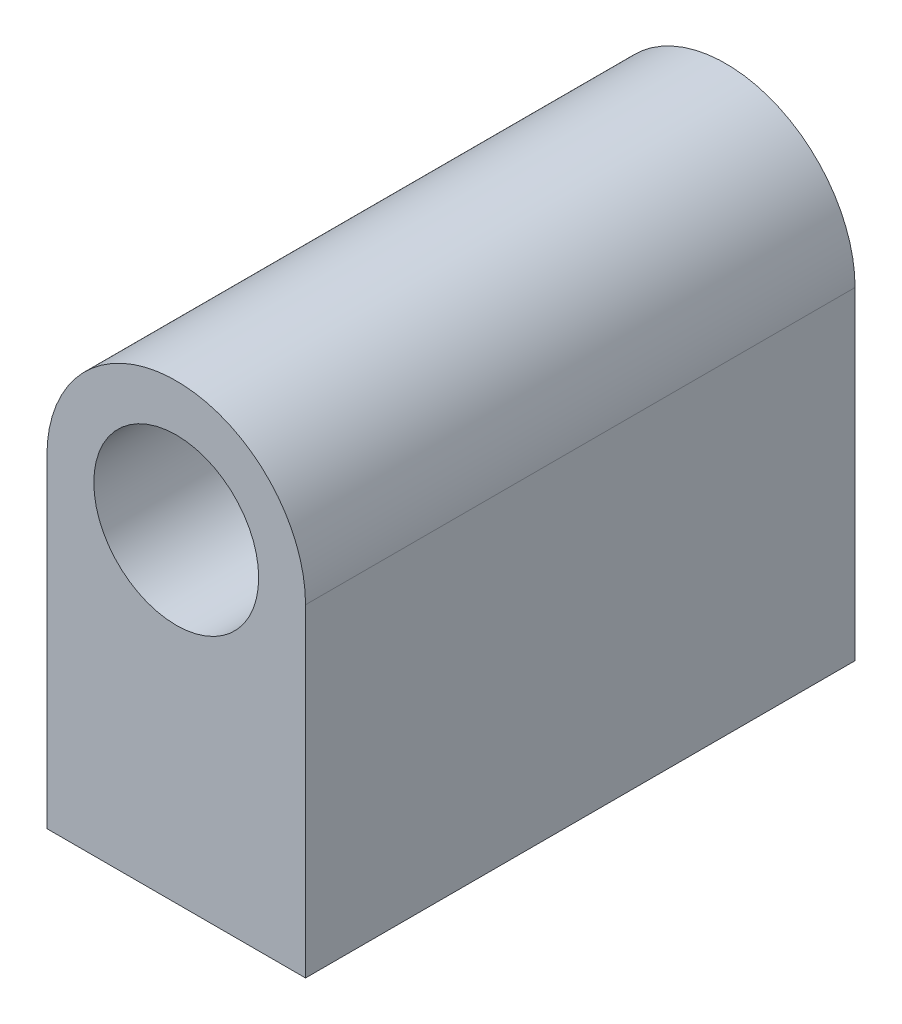
ISO-10303-21;
HEADER;
FILE_DESCRIPTION(('STEP AP214'),'2;1');
FILE_NAME('part.step','',(''),(''),'','','');
FILE_SCHEMA(('AUTOMOTIVE_DESIGN { 1 0 10303 214 1 1 1 1 }'));
ENDSEC;
DATA;
#1=APPLICATION_CONTEXT('core data for automotive mechanical design processes');
#2=APPLICATION_PROTOCOL_DEFINITION('international standard','automotive_design',2000,#1);
#3=PRODUCT_CONTEXT('',#1,'mechanical');
#4=PRODUCT('Part','Part','',(#3));
#5=PRODUCT_RELATED_PRODUCT_CATEGORY('part','',(#4));
#6=PRODUCT_DEFINITION_FORMATION('','',#4);
#7=PRODUCT_DEFINITION_CONTEXT('part definition',#1,'design');
#8=PRODUCT_DEFINITION('design','',#6,#7);
#9=PRODUCT_DEFINITION_SHAPE('','',#8);
#10=(LENGTH_UNIT() NAMED_UNIT(*) SI_UNIT(.MILLI.,.METRE.));
#11=(NAMED_UNIT(*) PLANE_ANGLE_UNIT() SI_UNIT($,.RADIAN.));
#12=(NAMED_UNIT(*) SI_UNIT($,.STERADIAN.) SOLID_ANGLE_UNIT());
#13=UNCERTAINTY_MEASURE_WITH_UNIT(LENGTH_MEASURE(1.E-05),#10,'distance_accuracy_value','');
#14=(GEOMETRIC_REPRESENTATION_CONTEXT(3) GLOBAL_UNCERTAINTY_ASSIGNED_CONTEXT((#13)) GLOBAL_UNIT_ASSIGNED_CONTEXT((#10,
#11,#12)) REPRESENTATION_CONTEXT('',''));
#15=CARTESIAN_POINT('',(0.,0.,0.));
#16=DIRECTION('',(0.,0.,1.));
#17=DIRECTION('',(1.,0.,0.));
#18=AXIS2_PLACEMENT_3D('',#15,#16,#17);
#19=CARTESIAN_POINT('',(0.,0.,6.));
#20=DIRECTION('',(0.,0.,-1.));
#21=DIRECTION('',(-1.,0.,0.));
#22=AXIS2_PLACEMENT_3D('',#19,#20,#21);
#23=CYLINDRICAL_SURFACE('',#22,4.);
#24=DIRECTION('',(0.,0.,-1.));
#25=VECTOR('',#24,1.);
#26=CARTESIAN_POINT('',(-4.,0.,33.1245154965971));
#27=LINE('',#26,#25);
#28=CARTESIAN_POINT('',(-4.,0.,17.));
#29=VERTEX_POINT('',#28);
#30=CARTESIAN_POINT('',(-4.,0.,0.));
#31=VERTEX_POINT('',#30);
#32=EDGE_CURVE('E77',#29,#31,#27,.T.);
#33=ORIENTED_EDGE('',*,*,#32,.F.);
#34=CARTESIAN_POINT('',(0.,0.,17.));
#35=DIRECTION('',(0.,0.,1.));
#36=DIRECTION('',(1.,0.,0.));
#37=AXIS2_PLACEMENT_3D('',#34,#35,#36);
#38=CIRCLE('',#37,4.);
#39=CARTESIAN_POINT('',(4.,0.,17.));
#40=VERTEX_POINT('',#39);
#41=EDGE_CURVE('E84',#40,#29,#38,.T.);
#42=ORIENTED_EDGE('',*,*,#41,.F.);
#43=DIRECTION('',(0.,0.,-1.));
#44=VECTOR('',#43,1.);
#45=CARTESIAN_POINT('',(4.,0.,33.1245154965971));
#46=LINE('',#45,#44);
#47=CARTESIAN_POINT('',(4.,0.,0.));
#48=VERTEX_POINT('',#47);
#49=EDGE_CURVE('E47',#40,#48,#46,.T.);
#50=ORIENTED_EDGE('',*,*,#49,.T.);
#51=CARTESIAN_POINT('',(0.,0.,0.));
#52=DIRECTION('',(0.,0.,1.));
#53=DIRECTION('',(1.,0.,0.));
#54=AXIS2_PLACEMENT_3D('',#51,#52,#53);
#55=CIRCLE('',#54,4.);
#56=EDGE_CURVE('E11',#48,#31,#55,.T.);
#57=ORIENTED_EDGE('',*,*,#56,.T.);
#58=EDGE_LOOP('',(#33,#42,#50,#57));
#59=FACE_BOUND('',#58,.T.);
#60=ADVANCED_FACE('F33',(#59),#23,.T.);
#61=CARTESIAN_POINT('',(0.,0.,6.));
#62=DIRECTION('',(0.,0.,1.));
#63=DIRECTION('',(1.,0.,0.));
#64=AXIS2_PLACEMENT_3D('',#61,#62,#63);
#65=PLANE('',#64);
#66=CARTESIAN_POINT('',(0.,0.,6.));
#67=DIRECTION('',(0.,0.,1.));
#68=DIRECTION('',(1.,0.,0.));
#69=AXIS2_PLACEMENT_3D('',#66,#67,#68);
#70=CIRCLE('',#69,2.3);
#71=CARTESIAN_POINT('',(2.3,0.,6.));
#72=VERTEX_POINT('',#71);
#73=EDGE_CURVE('E40',#72,#72,#70,.T.);
#74=ORIENTED_EDGE('',*,*,#73,.F.);
#75=EDGE_LOOP('',(#74));
#76=FACE_BOUND('',#75,.T.);
#77=CARTESIAN_POINT('',(0.,0.,6.));
#78=DIRECTION('',(0.,0.,1.));
#79=DIRECTION('',(1.,0.,0.));
#80=AXIS2_PLACEMENT_3D('',#77,#78,#79);
#81=CIRCLE('',#80,2.55);
#82=CARTESIAN_POINT('',(2.55,0.,6.));
#83=VERTEX_POINT('',#82);
#84=EDGE_CURVE('E95',#83,#83,#81,.T.);
#85=ORIENTED_EDGE('',*,*,#84,.T.);
#86=EDGE_LOOP('',(#85));
#87=FACE_BOUND('',#86,.T.);
#88=ADVANCED_FACE('F105',(#76,#87),#65,.T.);
#89=CARTESIAN_POINT('',(0.,0.,0.));
#90=DIRECTION('',(0.,0.,1.));
#91=DIRECTION('',(1.,0.,0.));
#92=AXIS2_PLACEMENT_3D('',#89,#90,#91);
#93=PLANE('',#92);
#94=ORIENTED_EDGE('',*,*,#56,.F.);
#95=DIRECTION('',(0.,-1.,0.));
#96=VECTOR('',#95,1.);
#97=CARTESIAN_POINT('',(4.,0.,0.));
#98=LINE('',#97,#96);
#99=CARTESIAN_POINT('',(4.,-10.,0.));
#100=VERTEX_POINT('',#99);
#101=EDGE_CURVE('E118',#48,#100,#98,.T.);
#102=ORIENTED_EDGE('',*,*,#101,.T.);
#103=DIRECTION('',(-1.,0.,0.));
#104=VECTOR('',#103,1.);
#105=CARTESIAN_POINT('',(4.,-10.,0.));
#106=LINE('',#105,#104);
#107=CARTESIAN_POINT('',(-4.,-10.,0.));
#108=VERTEX_POINT('',#107);
#109=EDGE_CURVE('E114',#100,#108,#106,.T.);
#110=ORIENTED_EDGE('',*,*,#109,.T.);
#111=DIRECTION('',(0.,1.,0.));
#112=VECTOR('',#111,1.);
#113=CARTESIAN_POINT('',(-4.,-10.,0.));
#114=LINE('',#113,#112);
#115=EDGE_CURVE('E113',#108,#31,#114,.T.);
#116=ORIENTED_EDGE('',*,*,#115,.T.);
#117=EDGE_LOOP('',(#94,#102,#110,#116));
#118=FACE_BOUND('',#117,.T.);
#119=CARTESIAN_POINT('',(0.,0.,0.));
#120=DIRECTION('',(0.,0.,1.));
#121=DIRECTION('',(1.,0.,0.));
#122=AXIS2_PLACEMENT_3D('',#119,#120,#121);
#123=CIRCLE('',#122,2.3);
#124=CARTESIAN_POINT('',(2.3,0.,0.));
#125=VERTEX_POINT('',#124);
#126=EDGE_CURVE('E90',#125,#125,#123,.T.);
#127=ORIENTED_EDGE('',*,*,#126,.T.);
#128=EDGE_LOOP('',(#127));
#129=FACE_BOUND('',#128,.T.);
#130=ADVANCED_FACE('F108',(#118,#129),#93,.F.);
#131=CARTESIAN_POINT('',(0.,0.,6.));
#132=DIRECTION('',(0.,0.,-1.));
#133=DIRECTION('',(-1.,0.,0.));
#134=AXIS2_PLACEMENT_3D('',#131,#132,#133);
#135=CYLINDRICAL_SURFACE('',#134,2.3);
#136=ORIENTED_EDGE('',*,*,#73,.T.);
#137=EDGE_LOOP('',(#136));
#138=FACE_BOUND('',#137,.T.);
#139=ORIENTED_EDGE('',*,*,#126,.F.);
#140=EDGE_LOOP('',(#139));
#141=FACE_BOUND('',#140,.T.);
#142=ADVANCED_FACE('F102',(#138,#141),#135,.F.);
#143=CARTESIAN_POINT('',(0.,0.,17.));
#144=DIRECTION('',(0.,0.,1.));
#145=DIRECTION('',(1.,0.,0.));
#146=AXIS2_PLACEMENT_3D('',#143,#144,#145);
#147=PLANE('',#146);
#148=ORIENTED_EDGE('',*,*,#41,.T.);
#149=DIRECTION('',(0.,1.,0.));
#150=VECTOR('',#149,1.);
#151=CARTESIAN_POINT('',(-4.,-10.,17.));
#152=LINE('',#151,#150);
#153=CARTESIAN_POINT('',(-4.,-10.,17.));
#154=VERTEX_POINT('',#153);
#155=EDGE_CURVE('E73',#154,#29,#152,.T.);
#156=ORIENTED_EDGE('',*,*,#155,.F.);
#157=DIRECTION('',(-1.,0.,0.));
#158=VECTOR('',#157,1.);
#159=CARTESIAN_POINT('',(4.,-10.,17.));
#160=LINE('',#159,#158);
#161=CARTESIAN_POINT('',(4.,-10.,17.));
#162=VERTEX_POINT('',#161);
#163=EDGE_CURVE('E55',#162,#154,#160,.T.);
#164=ORIENTED_EDGE('',*,*,#163,.F.);
#165=DIRECTION('',(0.,-1.,0.));
#166=VECTOR('',#165,1.);
#167=CARTESIAN_POINT('',(4.,0.,17.));
#168=LINE('',#167,#166);
#169=EDGE_CURVE('E89',#40,#162,#168,.T.);
#170=ORIENTED_EDGE('',*,*,#169,.F.);
#171=EDGE_LOOP('',(#148,#156,#164,#170));
#172=FACE_BOUND('',#171,.T.);
#173=CARTESIAN_POINT('',(0.,0.,17.));
#174=DIRECTION('',(0.,0.,1.));
#175=DIRECTION('',(1.,0.,0.));
#176=AXIS2_PLACEMENT_3D('',#173,#174,#175);
#177=CIRCLE('',#176,2.55);
#178=CARTESIAN_POINT('',(2.55,0.,17.));
#179=VERTEX_POINT('',#178);
#180=EDGE_CURVE('E91',#179,#179,#177,.T.);
#181=ORIENTED_EDGE('',*,*,#180,.F.);
#182=EDGE_LOOP('',(#181));
#183=FACE_BOUND('',#182,.T.);
#184=ADVANCED_FACE('F87',(#172,#183),#147,.T.);
#185=CARTESIAN_POINT('',(0.,0.,17.));
#186=DIRECTION('',(0.,0.,-1.));
#187=DIRECTION('',(-1.,0.,0.));
#188=AXIS2_PLACEMENT_3D('',#185,#186,#187);
#189=CYLINDRICAL_SURFACE('',#188,2.55);
#190=ORIENTED_EDGE('',*,*,#180,.T.);
#191=EDGE_LOOP('',(#190));
#192=FACE_BOUND('',#191,.T.);
#193=ORIENTED_EDGE('',*,*,#84,.F.);
#194=EDGE_LOOP('',(#193));
#195=FACE_BOUND('',#194,.T.);
#196=ADVANCED_FACE('F140',(#192,#195),#189,.F.);
#197=CARTESIAN_POINT('',(-4.,-10.,33.1245154965971));
#198=DIRECTION('',(-1.,0.,0.));
#199=DIRECTION('',(0.,-1.,0.));
#200=AXIS2_PLACEMENT_3D('',#197,#198,#199);
#201=PLANE('',#200);
#202=DIRECTION('',(0.,0.,-1.));
#203=VECTOR('',#202,1.);
#204=CARTESIAN_POINT('',(-4.,-10.,33.1245154965971));
#205=LINE('',#204,#203);
#206=EDGE_CURVE('E79',#154,#108,#205,.T.);
#207=ORIENTED_EDGE('',*,*,#206,.F.);
#208=ORIENTED_EDGE('',*,*,#155,.T.);
#209=ORIENTED_EDGE('',*,*,#32,.T.);
#210=ORIENTED_EDGE('',*,*,#115,.F.);
#211=EDGE_LOOP('',(#207,#208,#209,#210));
#212=FACE_BOUND('',#211,.T.);
#213=ADVANCED_FACE('F75',(#212),#201,.T.);
#214=CARTESIAN_POINT('',(4.,-10.,33.1245154965971));
#215=DIRECTION('',(0.,-1.,0.));
#216=DIRECTION('',(0.,0.,-1.));
#217=AXIS2_PLACEMENT_3D('',#214,#215,#216);
#218=PLANE('',#217);
#219=DIRECTION('',(0.,0.,-1.));
#220=VECTOR('',#219,1.);
#221=CARTESIAN_POINT('',(4.,-10.,33.1245154965971));
#222=LINE('',#221,#220);
#223=EDGE_CURVE('E123',#162,#100,#222,.T.);
#224=ORIENTED_EDGE('',*,*,#223,.F.);
#225=ORIENTED_EDGE('',*,*,#163,.T.);
#226=ORIENTED_EDGE('',*,*,#206,.T.);
#227=ORIENTED_EDGE('',*,*,#109,.F.);
#228=EDGE_LOOP('',(#224,#225,#226,#227));
#229=FACE_BOUND('',#228,.T.);
#230=ADVANCED_FACE('F132',(#229),#218,.T.);
#231=CARTESIAN_POINT('',(4.,0.,33.1245154965971));
#232=DIRECTION('',(1.,0.,0.));
#233=DIRECTION('',(0.,0.,-1.));
#234=AXIS2_PLACEMENT_3D('',#231,#232,#233);
#235=PLANE('',#234);
#236=ORIENTED_EDGE('',*,*,#49,.F.);
#237=ORIENTED_EDGE('',*,*,#169,.T.);
#238=ORIENTED_EDGE('',*,*,#223,.T.);
#239=ORIENTED_EDGE('',*,*,#101,.F.);
#240=EDGE_LOOP('',(#236,#237,#238,#239));
#241=FACE_BOUND('',#240,.T.);
#242=ADVANCED_FACE('F130',(#241),#235,.T.);
#243=CLOSED_SHELL('',(#60,#88,#130,#142,#184,#196,#213,#230,#242));
#244=MANIFOLD_SOLID_BREP('B2',#243);
#245=ADVANCED_BREP_SHAPE_REPRESENTATION('',(#18,#244),#14);
#246=SHAPE_DEFINITION_REPRESENTATION(#9,#245);
ENDSEC;
END-ISO-10303-21;
